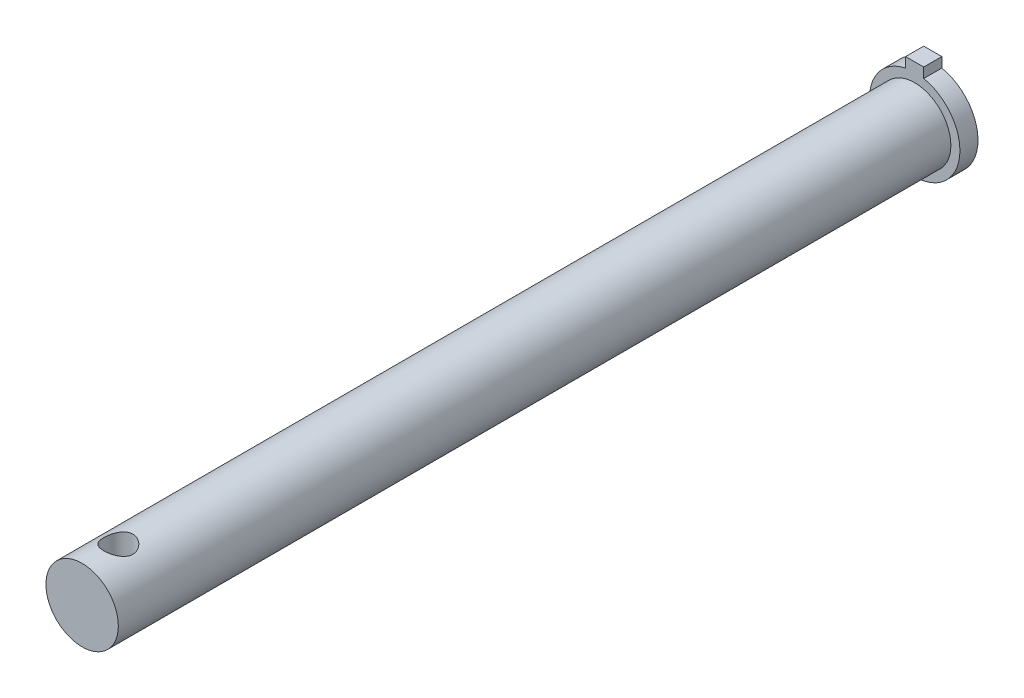
ISO-10303-21;
HEADER;
FILE_DESCRIPTION(('STEP AP214'),'2;1');
FILE_NAME('part.step','',(''),(''),'','','');
FILE_SCHEMA(('AUTOMOTIVE_DESIGN { 1 0 10303 214 1 1 1 1 }'));
ENDSEC;
DATA;
#1=APPLICATION_CONTEXT('core data for automotive mechanical design processes');
#2=APPLICATION_PROTOCOL_DEFINITION('international standard','automotive_design',2000,#1);
#3=PRODUCT_CONTEXT('',#1,'mechanical');
#4=PRODUCT('Part','Part','',(#3));
#5=PRODUCT_RELATED_PRODUCT_CATEGORY('part','',(#4));
#6=PRODUCT_DEFINITION_FORMATION('','',#4);
#7=PRODUCT_DEFINITION_CONTEXT('part definition',#1,'design');
#8=PRODUCT_DEFINITION('design','',#6,#7);
#9=PRODUCT_DEFINITION_SHAPE('','',#8);
#10=(LENGTH_UNIT() NAMED_UNIT(*) SI_UNIT(.MILLI.,.METRE.));
#11=(NAMED_UNIT(*) PLANE_ANGLE_UNIT() SI_UNIT($,.RADIAN.));
#12=(NAMED_UNIT(*) SI_UNIT($,.STERADIAN.) SOLID_ANGLE_UNIT());
#13=UNCERTAINTY_MEASURE_WITH_UNIT(LENGTH_MEASURE(1.E-05),#10,'distance_accuracy_value','');
#14=(GEOMETRIC_REPRESENTATION_CONTEXT(3) GLOBAL_UNCERTAINTY_ASSIGNED_CONTEXT((#13)) GLOBAL_UNIT_ASSIGNED_CONTEXT((#10,
#11,#12)) REPRESENTATION_CONTEXT('',''));
#15=CARTESIAN_POINT('',(0.,0.,0.));
#16=DIRECTION('',(0.,0.,1.));
#17=DIRECTION('',(1.,0.,0.));
#18=AXIS2_PLACEMENT_3D('',#15,#16,#17);
#19=CARTESIAN_POINT('',(0.,0.,5.));
#20=DIRECTION('',(0.,0.,1.));
#21=DIRECTION('',(1.,0.,0.));
#22=AXIS2_PLACEMENT_3D('',#19,#20,#21);
#23=PLANE('',#22);
#24=CARTESIAN_POINT('',(0.,0.,5.));
#25=DIRECTION('',(0.,0.,1.));
#26=DIRECTION('',(1.,0.,0.));
#27=AXIS2_PLACEMENT_3D('',#24,#25,#26);
#28=CIRCLE('',#27,12.5);
#29=CARTESIAN_POINT('',(-2.5,12.2474487139159,5.));
#30=VERTEX_POINT('',#29);
#31=CARTESIAN_POINT('',(2.5,12.2474487139159,5.));
#32=VERTEX_POINT('',#31);
#33=EDGE_CURVE('E11',#30,#32,#28,.T.);
#34=ORIENTED_EDGE('',*,*,#33,.T.);
#35=DIRECTION('',(0.,1.,0.));
#36=VECTOR('',#35,1.);
#37=CARTESIAN_POINT('',(2.5,-500000.,5.));
#38=LINE('',#37,#36);
#39=CARTESIAN_POINT('',(2.5,15.,5.));
#40=VERTEX_POINT('',#39);
#41=EDGE_CURVE('E104',#32,#40,#38,.T.);
#42=ORIENTED_EDGE('',*,*,#41,.T.);
#43=DIRECTION('',(1.,0.,0.));
#44=VECTOR('',#43,1.);
#45=CARTESIAN_POINT('',(-2.5,15.,5.));
#46=LINE('',#45,#44);
#47=CARTESIAN_POINT('',(-2.5,15.,5.));
#48=VERTEX_POINT('',#47);
#49=EDGE_CURVE('E95',#48,#40,#46,.T.);
#50=ORIENTED_EDGE('',*,*,#49,.F.);
#51=DIRECTION('',(0.,1.,0.));
#52=VECTOR('',#51,1.);
#53=CARTESIAN_POINT('',(-2.5,-500000.,5.));
#54=LINE('',#53,#52);
#55=EDGE_CURVE('E86',#30,#48,#54,.T.);
#56=ORIENTED_EDGE('',*,*,#55,.F.);
#57=EDGE_LOOP('',(#34,#42,#50,#56));
#58=FACE_BOUND('',#57,.T.);
#59=CARTESIAN_POINT('',(0.,0.,5.));
#60=DIRECTION('',(0.,0.,1.));
#61=DIRECTION('',(1.,0.,0.));
#62=AXIS2_PLACEMENT_3D('',#59,#60,#61);
#63=CIRCLE('',#62,10.);
#64=CARTESIAN_POINT('',(10.,0.,5.));
#65=VERTEX_POINT('',#64);
#66=EDGE_CURVE('E115',#65,#65,#63,.T.);
#67=ORIENTED_EDGE('',*,*,#66,.F.);
#68=EDGE_LOOP('',(#67));
#69=FACE_BOUND('',#68,.T.);
#70=ADVANCED_FACE('F33',(#58,#69),#23,.T.);
#71=CARTESIAN_POINT('',(0.,0.,5.));
#72=DIRECTION('',(0.,0.,-1.));
#73=DIRECTION('',(-1.,0.,0.));
#74=AXIS2_PLACEMENT_3D('',#71,#72,#73);
#75=CYLINDRICAL_SURFACE('',#74,12.5);
#76=ORIENTED_EDGE('',*,*,#33,.F.);
#77=DIRECTION('',(0.,0.,-1.));
#78=VECTOR('',#77,1.);
#79=CARTESIAN_POINT('',(-2.5,12.2474487139159,5.));
#80=LINE('',#79,#78);
#81=CARTESIAN_POINT('',(-2.5,12.2474487139357,0.));
#82=VERTEX_POINT('',#81);
#83=EDGE_CURVE('E107',#82,#30,#80,.F.);
#84=ORIENTED_EDGE('',*,*,#83,.F.);
#85=CARTESIAN_POINT('',(0.,0.,0.));
#86=DIRECTION('',(0.,0.,1.));
#87=DIRECTION('',(1.,0.,0.));
#88=AXIS2_PLACEMENT_3D('',#85,#86,#87);
#89=CIRCLE('',#88,12.5);
#90=CARTESIAN_POINT('',(2.5,12.2474487139159,0.));
#91=VERTEX_POINT('',#90);
#92=EDGE_CURVE('E46',#82,#91,#89,.T.);
#93=ORIENTED_EDGE('',*,*,#92,.T.);
#94=DIRECTION('',(0.,0.,-1.));
#95=VECTOR('',#94,1.);
#96=CARTESIAN_POINT('',(2.5,12.2474487139159,5.));
#97=LINE('',#96,#95);
#98=EDGE_CURVE('E57',#32,#91,#97,.T.);
#99=ORIENTED_EDGE('',*,*,#98,.F.);
#100=EDGE_LOOP('',(#76,#84,#93,#99));
#101=FACE_BOUND('',#100,.T.);
#102=ADVANCED_FACE('F35',(#101),#75,.T.);
#103=CARTESIAN_POINT('',(0.,0.,0.));
#104=DIRECTION('',(0.,0.,1.));
#105=DIRECTION('',(1.,0.,0.));
#106=AXIS2_PLACEMENT_3D('',#103,#104,#105);
#107=PLANE('',#106);
#108=ORIENTED_EDGE('',*,*,#92,.F.);
#109=DIRECTION('',(0.,1.,0.));
#110=VECTOR('',#109,1.);
#111=CARTESIAN_POINT('',(-2.5,-500000.,0.));
#112=LINE('',#111,#110);
#113=CARTESIAN_POINT('',(-2.5,15.,0.));
#114=VERTEX_POINT('',#113);
#115=EDGE_CURVE('E77',#82,#114,#112,.T.);
#116=ORIENTED_EDGE('',*,*,#115,.T.);
#117=DIRECTION('',(-1.,0.,0.));
#118=VECTOR('',#117,1.);
#119=CARTESIAN_POINT('',(-2.5,15.,0.));
#120=LINE('',#119,#118);
#121=CARTESIAN_POINT('',(2.5,15.,0.));
#122=VERTEX_POINT('',#121);
#123=EDGE_CURVE('E82',#122,#114,#120,.T.);
#124=ORIENTED_EDGE('',*,*,#123,.F.);
#125=DIRECTION('',(0.,1.,0.));
#126=VECTOR('',#125,1.);
#127=CARTESIAN_POINT('',(2.5,-500000.,0.));
#128=LINE('',#127,#126);
#129=EDGE_CURVE('E85',#91,#122,#128,.T.);
#130=ORIENTED_EDGE('',*,*,#129,.F.);
#131=EDGE_LOOP('',(#108,#116,#124,#130));
#132=FACE_BOUND('',#131,.T.);
#133=ADVANCED_FACE('F79',(#132),#107,.F.);
#134=CARTESIAN_POINT('',(0.,0.,235.));
#135=DIRECTION('',(0.,0.,-1.));
#136=DIRECTION('',(-1.,0.,0.));
#137=AXIS2_PLACEMENT_3D('',#134,#135,#136);
#138=CYLINDRICAL_SURFACE('',#137,10.);
#139=CARTESIAN_POINT('',(0.,-10.,229.));
#140=CARTESIAN_POINT('',(0.107549581345536,-9.99999886871264,228.999998425067));
#141=CARTESIAN_POINT('',(0.21513214794036,-9.99825999367799,228.99565632892));
#142=CARTESIAN_POINT('',(0.429535200549547,-9.99134740691108,228.978326617216));
#143=CARTESIAN_POINT('',(0.536355162703301,-9.98617152790588,228.965333546597));
#144=CARTESIAN_POINT('',(0.748635856497416,-9.97250573560117,228.930791965449));
#145=CARTESIAN_POINT('',(0.854093134440867,-9.96400865312143,228.90922494538));
#146=CARTESIAN_POINT('',(1.06266761114009,-9.94393017211574,228.857758269563));
#147=CARTESIAN_POINT('',(1.16578384227259,-9.932347522545,228.827855233745));
#148=CARTESIAN_POINT('',(1.46979509681069,-9.89349112162205,228.726277191284));
#149=CARTESIAN_POINT('',(1.66629107461993,-9.86204458846134,228.642578180994));
#150=CARTESIAN_POINT('',(2.04217417878102,-9.79113035538708,228.44595378265));
#151=CARTESIAN_POINT('',(2.22156721456798,-9.75166544086262,228.333038539885));
#152=CARTESIAN_POINT('',(2.56699339938209,-9.66661825353092,228.075531245478));
#153=CARTESIAN_POINT('',(2.73212223266509,-9.62084608086599,227.929787289424));
#154=CARTESIAN_POINT('',(3.03635232313264,-9.52921139577231,227.613199390848));
#155=CARTESIAN_POINT('',(3.17544084661153,-9.48334885017047,227.442343240983));
#156=CARTESIAN_POINT('',(3.42974847409894,-9.39445587657959,227.071144031434));
#157=CARTESIAN_POINT('',(3.54362978572887,-9.35164233015934,226.869827073936));
#158=CARTESIAN_POINT('',(3.73550961465234,-9.2766729328807,226.448927157199));
#159=CARTESIAN_POINT('',(3.81352517485723,-9.24451202207146,226.229352932259));
#160=CARTESIAN_POINT('',(3.92779760260542,-9.19652715590089,225.788575344314));
#161=CARTESIAN_POINT('',(3.96578791979827,-9.18002840771384,225.567897531912));
#162=CARTESIAN_POINT('',(4.00434593508728,-9.16328008038142,225.122730000323));
#163=CARTESIAN_POINT('',(4.00493203570086,-9.16302251073203,224.898242209989));
#164=CARTESIAN_POINT('',(3.9699787321474,-9.17821000534301,224.468486657777));
#165=CARTESIAN_POINT('',(3.93695062778272,-9.19256349925666,224.262968571234));
#166=CARTESIAN_POINT('',(3.83989376129508,-9.23352375055553,223.86068088765));
#167=CARTESIAN_POINT('',(3.77585958980135,-9.26013264599921,223.663912823694));
#168=CARTESIAN_POINT('',(3.6173894649114,-9.32318970221162,223.279964327708));
#169=CARTESIAN_POINT('',(3.52235972457939,-9.35982758573424,223.093061521918));
#170=CARTESIAN_POINT('',(3.30501292151569,-9.43876232767927,222.73716836725));
#171=CARTESIAN_POINT('',(3.18268561021591,-9.48106130910411,222.568184781187));
#172=CARTESIAN_POINT('',(2.90310119889358,-9.57053473488081,222.239180542404));
#173=CARTESIAN_POINT('',(2.74387492593719,-9.61783329953252,222.08086254111));
#174=CARTESIAN_POINT('',(2.4006288548645,-9.70919649915614,221.792631043994));
#175=CARTESIAN_POINT('',(2.21660413066998,-9.75326048890393,221.662723205179));
#176=CARTESIAN_POINT('',(1.82415530521055,-9.83429362529359,221.432765105169));
#177=CARTESIAN_POINT('',(1.61532098269265,-9.87110540190899,221.333355437606));
#178=CARTESIAN_POINT('',(1.18204753096606,-9.93229656657448,221.171664277844));
#179=CARTESIAN_POINT('',(0.957616393699404,-9.95668226924746,221.109363924885));
#180=CARTESIAN_POINT('',(0.513791775215601,-9.98912279013838,221.027103409161));
#181=CARTESIAN_POINT('',(0.294886587971151,-9.99805891667034,221.004855091493));
#182=CARTESIAN_POINT('',(-0.143690619615697,-10.0013695702126,220.996573798943));
#183=CARTESIAN_POINT('',(-0.363362426448175,-9.99574787164577,221.010531436905));
#184=CARTESIAN_POINT('',(-0.786865478243648,-9.97115134127512,221.072583505104));
#185=CARTESIAN_POINT('',(-0.990964983549755,-9.95278782691064,221.119115960703));
#186=CARTESIAN_POINT('',(-1.38827085612274,-9.90518882810983,221.242871416619));
#187=CARTESIAN_POINT('',(-1.58147582045411,-9.87595194712999,221.320098359335));
#188=CARTESIAN_POINT('',(-1.95815757162884,-9.80833189541687,221.505569879362));
#189=CARTESIAN_POINT('',(-2.14115604549353,-9.76969631959847,221.614690944095));
#190=CARTESIAN_POINT('',(-2.4868871825104,-9.68746729490809,221.859880647803));
#191=CARTESIAN_POINT('',(-2.64961168158684,-9.64387186219643,221.995960085814));
#192=CARTESIAN_POINT('',(-2.96144608598877,-9.55290235277181,222.301740025933));
#193=CARTESIAN_POINT('',(-3.10894786734724,-9.50546882853788,222.473067083141));
#194=CARTESIAN_POINT('',(-3.37350239509233,-9.41483345830581,222.83888016589));
#195=CARTESIAN_POINT('',(-3.4905501236659,-9.37163231039242,223.033370000199));
#196=CARTESIAN_POINT('',(-3.69161500286276,-9.2942859982933,223.442923389673));
#197=CARTESIAN_POINT('',(-3.77530118531765,-9.26023261821741,223.658168000243));
#198=CARTESIAN_POINT('',(-3.90459244315908,-9.20647346903737,224.101467301613));
#199=CARTESIAN_POINT('',(-3.95022562452797,-9.18675711197461,224.329512404842));
#200=CARTESIAN_POINT('',(-3.99943122157417,-9.16543518780389,224.774255809844));
#201=CARTESIAN_POINT('',(-4.0057941177721,-9.16262842667612,224.990589701895));
#202=CARTESIAN_POINT('',(-3.98360636538274,-9.17229671415009,225.421089692721));
#203=CARTESIAN_POINT('',(-3.9550601501471,-9.18476982225497,225.635256063282));
#204=CARTESIAN_POINT('',(-3.86614256488129,-9.2225330048627,226.04666446089));
#205=CARTESIAN_POINT('',(-3.80707437387707,-9.2472967218297,226.244240846221));
#206=CARTESIAN_POINT('',(-3.66001151041638,-9.30647993934965,226.62675696179));
#207=CARTESIAN_POINT('',(-3.57200884934551,-9.34090210615104,226.811693185111));
#208=CARTESIAN_POINT('',(-3.36374310804134,-9.4179725282647,227.175220410709));
#209=CARTESIAN_POINT('',(-3.24192140926544,-9.46097893410836,227.352841830688));
#210=CARTESIAN_POINT('',(-2.97179350239178,-9.54927479921251,227.685982142625));
#211=CARTESIAN_POINT('',(-2.82347931168582,-9.59456494363941,227.84149434729));
#212=CARTESIAN_POINT('',(-2.492974124467,-9.68587647140964,228.136423592531));
#213=CARTESIAN_POINT('',(-2.30921017071956,-9.73175488236393,228.274143383982));
#214=CARTESIAN_POINT('',(-2.01716584575533,-9.7949502762577,228.456048108938));
#215=CARTESIAN_POINT('',(-1.91699501972424,-9.81509269692655,228.512607063853));
#216=CARTESIAN_POINT('',(-1.71180110982479,-9.85294835133019,228.617037995405));
#217=CARTESIAN_POINT('',(-1.60678027559742,-9.87066269647665,228.664913949808));
#218=CARTESIAN_POINT('',(-1.39454646904327,-9.9028559935491,228.750747984685));
#219=CARTESIAN_POINT('',(-1.28740777135871,-9.91738778532477,228.788870154747));
#220=CARTESIAN_POINT('',(-1.06995577523383,-9.94319722915714,228.855921347721));
#221=CARTESIAN_POINT('',(-0.959643983352612,-9.95447639837582,228.88485465735));
#222=CARTESIAN_POINT('',(-0.73694521585683,-9.97343330649399,228.933174836149));
#223=CARTESIAN_POINT('',(-0.624564263591275,-9.98112017494336,228.952585911645));
#224=CARTESIAN_POINT('',(-0.398419132407597,-9.99270031578293,228.981738570666));
#225=CARTESIAN_POINT('',(-0.284655994966347,-9.99659628445551,228.991487026834));
#226=CARTESIAN_POINT('',(-0.113830463425488,-9.99951445883957,228.998785895573));
#227=CARTESIAN_POINT('',(-0.0569198512645281,-10.0000005987258,229.000000833522));
#228=CARTESIAN_POINT('',(0.,-10.,229.));
#229=B_SPLINE_CURVE_WITH_KNOTS('',3,(#139,#140,#141,#142,#143,#144,#145,#146,#147,#148,#149,
#150,#151,#152,#153,#154,#155,#156,#157,#158,#159,#160,#161,#162,#163,#164,#165,#166,#167,#168,
#169,#170,#171,#172,#173,#174,#175,#176,#177,#178,#179,#180,#181,#182,#183,#184,#185,#186,#187,
#188,#189,#190,#191,#192,#193,#194,#195,#196,#197,#198,#199,#200,#201,#202,#203,#204,#205,#206,
#207,#208,#209,#210,#211,#212,#213,#214,#215,#216,#217,#218,#219,#220,#221,#222,#223,#224,#225,
#226,#227,#228),.UNSPECIFIED.,.T.,.F.,(4,2,2,2,2,2,2,2,2,2,2,2,2,2,2,2,2,2,2,2,2,2,2,2,2,2,2,2,
2,2,2,2,2,2,2,2,2,2,2,2,2,2,2,2,4),(0.,0.322603993422153,0.645411604786482,0.968919914471231,
1.29255959093094,1.93701523385825,2.58124739027476,3.25313995292304,3.92536021760331,
4.62749749529942,5.32930078128046,5.99927442509169,6.66891844572486,7.29195888698822,
7.91510806412269,8.55097484497806,9.18708075776541,9.87235930273287,10.5577741757964,
11.2567305822579,11.9553314412776,12.6125760095619,13.2696501904034,13.8972014302891,
14.5248332988777,15.171662586967,15.8187515089811,16.50856181149,17.1984856998767,
17.8950932218183,18.5911857719204,19.2371857868567,19.8831037702626,20.5034786899771,
21.124025035105,21.7801016801356,22.4363763459696,23.1352007896785,23.4851924266232,
23.8350233218042,24.1785111324565,24.52183846562,24.8642884495951,25.2064946871486,
25.3772305569977),.UNSPECIFIED.);
#230=CARTESIAN_POINT('',(0.,-10.,229.));
#231=VERTEX_POINT('',#230);
#232=EDGE_CURVE('E37',#231,#231,#229,.T.);
#233=ORIENTED_EDGE('',*,*,#232,.T.);
#234=EDGE_LOOP('',(#233));
#235=FACE_BOUND('',#234,.T.);
#236=CARTESIAN_POINT('',(0.,10.,229.));
#237=CARTESIAN_POINT('',(-0.107549581345536,9.99999886871264,228.999998425067));
#238=CARTESIAN_POINT('',(-0.21513214794036,9.99825999367799,228.99565632892));
#239=CARTESIAN_POINT('',(-0.429535200549547,9.99134740691108,228.978326617216));
#240=CARTESIAN_POINT('',(-0.536355162703301,9.98617152790588,228.965333546597));
#241=CARTESIAN_POINT('',(-0.748635856497416,9.97250573560117,228.930791965449));
#242=CARTESIAN_POINT('',(-0.854093134440867,9.96400865312143,228.90922494538));
#243=CARTESIAN_POINT('',(-1.06266761114009,9.94393017211574,228.857758269563));
#244=CARTESIAN_POINT('',(-1.16578384227259,9.932347522545,228.827855233745));
#245=CARTESIAN_POINT('',(-1.46979509681069,9.89349112162205,228.726277191284));
#246=CARTESIAN_POINT('',(-1.66629107461993,9.86204458846134,228.642578180994));
#247=CARTESIAN_POINT('',(-2.04217417878102,9.79113035538708,228.44595378265));
#248=CARTESIAN_POINT('',(-2.22156721456798,9.75166544086262,228.333038539885));
#249=CARTESIAN_POINT('',(-2.56699339938209,9.66661825353092,228.075531245478));
#250=CARTESIAN_POINT('',(-2.73212223266509,9.62084608086599,227.929787289424));
#251=CARTESIAN_POINT('',(-3.03635232313264,9.52921139577231,227.613199390848));
#252=CARTESIAN_POINT('',(-3.17544084661153,9.48334885017047,227.442343240983));
#253=CARTESIAN_POINT('',(-3.42974847409894,9.39445587657959,227.071144031434));
#254=CARTESIAN_POINT('',(-3.54362978572887,9.35164233015934,226.869827073936));
#255=CARTESIAN_POINT('',(-3.73550961465234,9.2766729328807,226.448927157199));
#256=CARTESIAN_POINT('',(-3.81352517485723,9.24451202207146,226.229352932259));
#257=CARTESIAN_POINT('',(-3.92779760260542,9.19652715590089,225.788575344314));
#258=CARTESIAN_POINT('',(-3.96578791979827,9.18002840771384,225.567897531912));
#259=CARTESIAN_POINT('',(-4.00434593508728,9.16328008038142,225.122730000323));
#260=CARTESIAN_POINT('',(-4.00493203570086,9.16302251073203,224.898242209989));
#261=CARTESIAN_POINT('',(-3.9699787321474,9.17821000534301,224.468486657777));
#262=CARTESIAN_POINT('',(-3.93695062778272,9.19256349925666,224.262968571234));
#263=CARTESIAN_POINT('',(-3.83989376129508,9.23352375055553,223.86068088765));
#264=CARTESIAN_POINT('',(-3.77585958980135,9.26013264599921,223.663912823694));
#265=CARTESIAN_POINT('',(-3.6173894649114,9.32318970221162,223.279964327708));
#266=CARTESIAN_POINT('',(-3.52235972457939,9.35982758573424,223.093061521918));
#267=CARTESIAN_POINT('',(-3.30501292151569,9.43876232767927,222.73716836725));
#268=CARTESIAN_POINT('',(-3.18268561021591,9.48106130910411,222.568184781187));
#269=CARTESIAN_POINT('',(-2.90310119889358,9.57053473488081,222.239180542404));
#270=CARTESIAN_POINT('',(-2.74387492593719,9.61783329953252,222.08086254111));
#271=CARTESIAN_POINT('',(-2.4006288548645,9.70919649915614,221.792631043994));
#272=CARTESIAN_POINT('',(-2.21660413066998,9.75326048890393,221.662723205179));
#273=CARTESIAN_POINT('',(-1.82415530521055,9.83429362529359,221.432765105169));
#274=CARTESIAN_POINT('',(-1.61532098269265,9.87110540190899,221.333355437606));
#275=CARTESIAN_POINT('',(-1.18204753096606,9.93229656657448,221.171664277844));
#276=CARTESIAN_POINT('',(-0.957616393699404,9.95668226924746,221.109363924885));
#277=CARTESIAN_POINT('',(-0.513791775215601,9.98912279013838,221.027103409161));
#278=CARTESIAN_POINT('',(-0.294886587971151,9.99805891667034,221.004855091493));
#279=CARTESIAN_POINT('',(0.143690619615697,10.0013695702126,220.996573798943));
#280=CARTESIAN_POINT('',(0.363362426448175,9.99574787164577,221.010531436905));
#281=CARTESIAN_POINT('',(0.786865478243648,9.97115134127512,221.072583505104));
#282=CARTESIAN_POINT('',(0.990964983549755,9.95278782691064,221.119115960703));
#283=CARTESIAN_POINT('',(1.38827085612274,9.90518882810983,221.242871416619));
#284=CARTESIAN_POINT('',(1.58147582045411,9.87595194712999,221.320098359335));
#285=CARTESIAN_POINT('',(1.95815757162884,9.80833189541687,221.505569879362));
#286=CARTESIAN_POINT('',(2.14115604549353,9.76969631959847,221.614690944095));
#287=CARTESIAN_POINT('',(2.4868871825104,9.68746729490809,221.859880647803));
#288=CARTESIAN_POINT('',(2.64961168158684,9.64387186219643,221.995960085814));
#289=CARTESIAN_POINT('',(2.96144608598877,9.55290235277181,222.301740025933));
#290=CARTESIAN_POINT('',(3.10894786734724,9.50546882853788,222.473067083141));
#291=CARTESIAN_POINT('',(3.37350239509233,9.41483345830581,222.83888016589));
#292=CARTESIAN_POINT('',(3.4905501236659,9.37163231039242,223.033370000199));
#293=CARTESIAN_POINT('',(3.69161500286276,9.2942859982933,223.442923389673));
#294=CARTESIAN_POINT('',(3.77530118531765,9.26023261821741,223.658168000243));
#295=CARTESIAN_POINT('',(3.90459244315908,9.20647346903737,224.101467301613));
#296=CARTESIAN_POINT('',(3.95022562452797,9.18675711197461,224.329512404842));
#297=CARTESIAN_POINT('',(3.99943122157417,9.16543518780389,224.774255809844));
#298=CARTESIAN_POINT('',(4.0057941177721,9.16262842667612,224.990589701895));
#299=CARTESIAN_POINT('',(3.98360636538274,9.17229671415009,225.421089692721));
#300=CARTESIAN_POINT('',(3.9550601501471,9.18476982225497,225.635256063282));
#301=CARTESIAN_POINT('',(3.86614256488129,9.2225330048627,226.04666446089));
#302=CARTESIAN_POINT('',(3.80707437387707,9.2472967218297,226.244240846221));
#303=CARTESIAN_POINT('',(3.66001151041638,9.30647993934965,226.62675696179));
#304=CARTESIAN_POINT('',(3.57200884934551,9.34090210615104,226.811693185111));
#305=CARTESIAN_POINT('',(3.36374310804134,9.4179725282647,227.175220410709));
#306=CARTESIAN_POINT('',(3.24192140926544,9.46097893410836,227.352841830688));
#307=CARTESIAN_POINT('',(2.97179350239178,9.54927479921251,227.685982142625));
#308=CARTESIAN_POINT('',(2.82347931168582,9.59456494363941,227.84149434729));
#309=CARTESIAN_POINT('',(2.492974124467,9.68587647140964,228.136423592531));
#310=CARTESIAN_POINT('',(2.30921017071956,9.73175488236393,228.274143383982));
#311=CARTESIAN_POINT('',(2.01716584575533,9.7949502762577,228.456048108938));
#312=CARTESIAN_POINT('',(1.91699501972424,9.81509269692655,228.512607063853));
#313=CARTESIAN_POINT('',(1.71180110982479,9.85294835133019,228.617037995405));
#314=CARTESIAN_POINT('',(1.60678027559742,9.87066269647665,228.664913949808));
#315=CARTESIAN_POINT('',(1.39454646904327,9.9028559935491,228.750747984685));
#316=CARTESIAN_POINT('',(1.28740777135871,9.91738778532477,228.788870154747));
#317=CARTESIAN_POINT('',(1.06995577523383,9.94319722915714,228.855921347721));
#318=CARTESIAN_POINT('',(0.959643983352612,9.95447639837582,228.88485465735));
#319=CARTESIAN_POINT('',(0.73694521585683,9.97343330649399,228.933174836149));
#320=CARTESIAN_POINT('',(0.624564263591275,9.98112017494336,228.952585911645));
#321=CARTESIAN_POINT('',(0.398419132407597,9.99270031578293,228.981738570666));
#322=CARTESIAN_POINT('',(0.284655994966347,9.99659628445551,228.991487026834));
#323=CARTESIAN_POINT('',(0.113830463425488,9.99951445883957,228.998785895573));
#324=CARTESIAN_POINT('',(0.0569198512645281,10.0000005987258,229.000000833522));
#325=CARTESIAN_POINT('',(0.,10.,229.));
#326=B_SPLINE_CURVE_WITH_KNOTS('',3,(#236,#237,#238,#239,#240,#241,#242,#243,#244,#245,#246,
#247,#248,#249,#250,#251,#252,#253,#254,#255,#256,#257,#258,#259,#260,#261,#262,#263,#264,#265,
#266,#267,#268,#269,#270,#271,#272,#273,#274,#275,#276,#277,#278,#279,#280,#281,#282,#283,#284,
#285,#286,#287,#288,#289,#290,#291,#292,#293,#294,#295,#296,#297,#298,#299,#300,#301,#302,#303,
#304,#305,#306,#307,#308,#309,#310,#311,#312,#313,#314,#315,#316,#317,#318,#319,#320,#321,#322,
#323,#324,#325),.UNSPECIFIED.,.T.,.F.,(4,2,2,2,2,2,2,2,2,2,2,2,2,2,2,2,2,2,2,2,2,2,2,2,2,2,2,2,
2,2,2,2,2,2,2,2,2,2,2,2,2,2,2,2,4),(0.,0.322603993422153,0.645411604786482,0.968919914471231,
1.29255959093094,1.93701523385825,2.58124739027476,3.25313995292304,3.92536021760331,
4.62749749529942,5.32930078128046,5.99927442509169,6.66891844572486,7.29195888698822,
7.91510806412269,8.55097484497806,9.18708075776541,9.87235930273287,10.5577741757964,
11.2567305822579,11.9553314412776,12.6125760095619,13.2696501904034,13.8972014302891,
14.5248332988777,15.171662586967,15.8187515089811,16.50856181149,17.1984856998767,
17.8950932218183,18.5911857719204,19.2371857868567,19.8831037702626,20.5034786899771,
21.124025035105,21.7801016801356,22.4363763459696,23.1352007896785,23.4851924266232,
23.8350233218042,24.1785111324565,24.52183846562,24.8642884495951,25.2064946871486,
25.3772305569977),.UNSPECIFIED.);
#327=CARTESIAN_POINT('',(0.,10.,229.));
#328=VERTEX_POINT('',#327);
#329=EDGE_CURVE('E111',#328,#328,#326,.T.);
#330=ORIENTED_EDGE('',*,*,#329,.T.);
#331=EDGE_LOOP('',(#330));
#332=FACE_BOUND('',#331,.T.);
#333=CARTESIAN_POINT('',(0.,0.,235.));
#334=DIRECTION('',(0.,0.,1.));
#335=DIRECTION('',(1.,0.,0.));
#336=AXIS2_PLACEMENT_3D('',#333,#334,#335);
#337=CIRCLE('',#336,10.);
#338=CARTESIAN_POINT('',(10.,0.,235.));
#339=VERTEX_POINT('',#338);
#340=EDGE_CURVE('E112',#339,#339,#337,.T.);
#341=ORIENTED_EDGE('',*,*,#340,.F.);
#342=EDGE_LOOP('',(#341));
#343=FACE_BOUND('',#342,.T.);
#344=ORIENTED_EDGE('',*,*,#66,.T.);
#345=EDGE_LOOP('',(#344));
#346=FACE_BOUND('',#345,.T.);
#347=ADVANCED_FACE('F121',(#235,#332,#343,#346),#138,.T.);
#348=CARTESIAN_POINT('',(0.,0.,235.));
#349=DIRECTION('',(0.,0.,1.));
#350=DIRECTION('',(1.,0.,0.));
#351=AXIS2_PLACEMENT_3D('',#348,#349,#350);
#352=PLANE('',#351);
#353=ORIENTED_EDGE('',*,*,#340,.T.);
#354=EDGE_LOOP('',(#353));
#355=FACE_BOUND('',#354,.T.);
#356=ADVANCED_FACE('F129',(#355),#352,.T.);
#357=CARTESIAN_POINT('',(0.,-12.5,225.));
#358=DIRECTION('',(0.,1.,0.));
#359=DIRECTION('',(0.,0.,1.));
#360=AXIS2_PLACEMENT_3D('',#357,#358,#359);
#361=CYLINDRICAL_SURFACE('',#360,4.);
#362=ORIENTED_EDGE('',*,*,#329,.F.);
#363=EDGE_LOOP('',(#362));
#364=FACE_BOUND('',#363,.T.);
#365=ORIENTED_EDGE('',*,*,#232,.F.);
#366=EDGE_LOOP('',(#365));
#367=FACE_BOUND('',#366,.T.);
#368=ADVANCED_FACE('F125',(#364,#367),#361,.F.);
#369=CARTESIAN_POINT('',(-2.5,-500000.,5.));
#370=DIRECTION('',(-1.,0.,0.));
#371=DIRECTION('',(0.,0.,1.));
#372=AXIS2_PLACEMENT_3D('',#369,#370,#371);
#373=PLANE('',#372);
#374=ORIENTED_EDGE('',*,*,#115,.F.);
#375=ORIENTED_EDGE('',*,*,#83,.T.);
#376=ORIENTED_EDGE('',*,*,#55,.T.);
#377=DIRECTION('',(0.,0.,1.));
#378=VECTOR('',#377,1.);
#379=CARTESIAN_POINT('',(-2.5,15.,5.));
#380=LINE('',#379,#378);
#381=EDGE_CURVE('E89',#114,#48,#380,.T.);
#382=ORIENTED_EDGE('',*,*,#381,.F.);
#383=EDGE_LOOP('',(#374,#375,#376,#382));
#384=FACE_BOUND('',#383,.T.);
#385=ADVANCED_FACE('F90',(#384),#373,.T.);
#386=CARTESIAN_POINT('',(0.,15.,0.));
#387=DIRECTION('',(0.,-1.,0.));
#388=DIRECTION('',(0.,0.,-1.));
#389=AXIS2_PLACEMENT_3D('',#386,#387,#388);
#390=PLANE('',#389);
#391=DIRECTION('',(0.,0.,-1.));
#392=VECTOR('',#391,1.);
#393=CARTESIAN_POINT('',(2.5,15.,5.));
#394=LINE('',#393,#392);
#395=EDGE_CURVE('E99',#40,#122,#394,.T.);
#396=ORIENTED_EDGE('',*,*,#395,.T.);
#397=ORIENTED_EDGE('',*,*,#123,.T.);
#398=ORIENTED_EDGE('',*,*,#381,.T.);
#399=ORIENTED_EDGE('',*,*,#49,.T.);
#400=EDGE_LOOP('',(#396,#397,#398,#399));
#401=FACE_BOUND('',#400,.T.);
#402=ADVANCED_FACE('F97',(#401),#390,.F.);
#403=CARTESIAN_POINT('',(2.5,-500000.,5.));
#404=DIRECTION('',(1.,0.,0.));
#405=DIRECTION('',(0.,0.,-1.));
#406=AXIS2_PLACEMENT_3D('',#403,#404,#405);
#407=PLANE('',#406);
#408=ORIENTED_EDGE('',*,*,#41,.F.);
#409=ORIENTED_EDGE('',*,*,#98,.T.);
#410=ORIENTED_EDGE('',*,*,#129,.T.);
#411=ORIENTED_EDGE('',*,*,#395,.F.);
#412=EDGE_LOOP('',(#408,#409,#410,#411));
#413=FACE_BOUND('',#412,.T.);
#414=ADVANCED_FACE('F131',(#413),#407,.T.);
#415=CLOSED_SHELL('',(#70,#102,#133,#347,#356,#368,#385,#402,#414));
#416=MANIFOLD_SOLID_BREP('B2',#415);
#417=ADVANCED_BREP_SHAPE_REPRESENTATION('',(#18,#416),#14);
#418=SHAPE_DEFINITION_REPRESENTATION(#9,#417);
ENDSEC;
END-ISO-10303-21;
